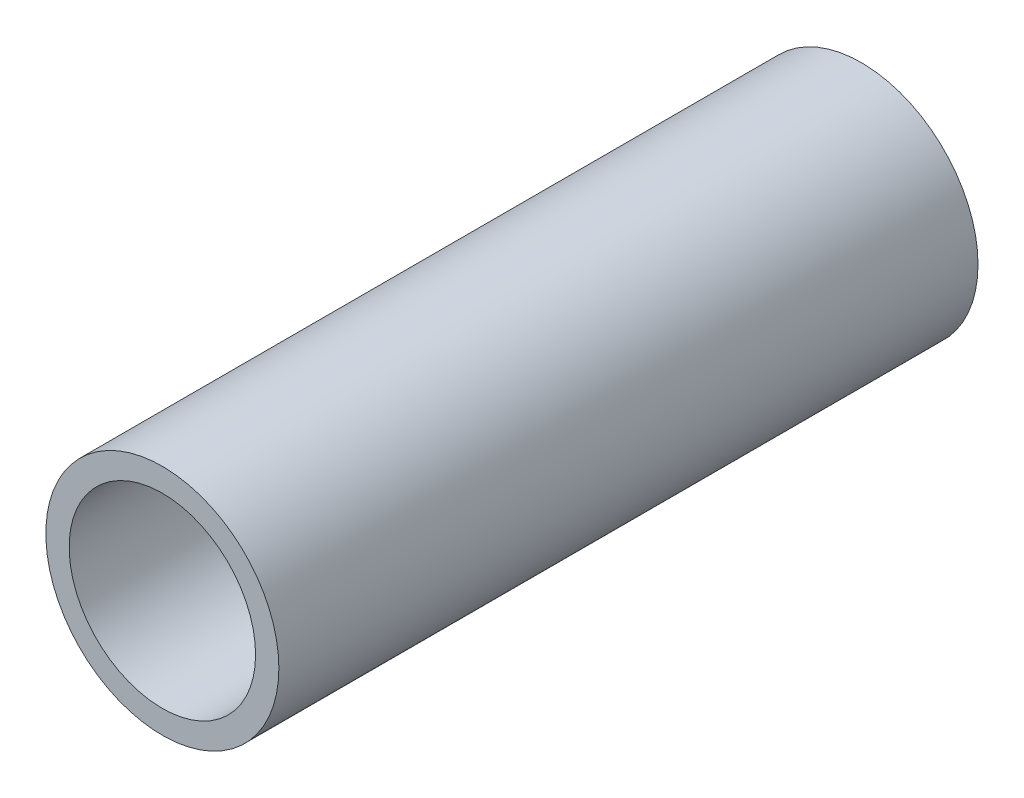
ISO-10303-21;
HEADER;
FILE_DESCRIPTION(('STEP AP214'),'2;1');
FILE_NAME('part.step','',(''),(''),'','','');
FILE_SCHEMA(('AUTOMOTIVE_DESIGN { 1 0 10303 214 1 1 1 1 }'));
ENDSEC;
DATA;
#1=APPLICATION_CONTEXT('core data for automotive mechanical design processes');
#2=APPLICATION_PROTOCOL_DEFINITION('international standard','automotive_design',2000,#1);
#3=PRODUCT_CONTEXT('',#1,'mechanical');
#4=PRODUCT('Part','Part','',(#3));
#5=PRODUCT_RELATED_PRODUCT_CATEGORY('part','',(#4));
#6=PRODUCT_DEFINITION_FORMATION('','',#4);
#7=PRODUCT_DEFINITION_CONTEXT('part definition',#1,'design');
#8=PRODUCT_DEFINITION('design','',#6,#7);
#9=PRODUCT_DEFINITION_SHAPE('','',#8);
#10=(LENGTH_UNIT() NAMED_UNIT(*) SI_UNIT(.MILLI.,.METRE.));
#11=(NAMED_UNIT(*) PLANE_ANGLE_UNIT() SI_UNIT($,.RADIAN.));
#12=(NAMED_UNIT(*) SI_UNIT($,.STERADIAN.) SOLID_ANGLE_UNIT());
#13=UNCERTAINTY_MEASURE_WITH_UNIT(LENGTH_MEASURE(1.E-05),#10,'distance_accuracy_value','');
#14=(GEOMETRIC_REPRESENTATION_CONTEXT(3) GLOBAL_UNCERTAINTY_ASSIGNED_CONTEXT((#13)) GLOBAL_UNIT_ASSIGNED_CONTEXT((#10,
#11,#12)) REPRESENTATION_CONTEXT('',''));
#15=CARTESIAN_POINT('',(0.,0.,0.));
#16=DIRECTION('',(0.,0.,1.));
#17=DIRECTION('',(1.,0.,0.));
#18=AXIS2_PLACEMENT_3D('',#15,#16,#17);
#19=CARTESIAN_POINT('',(0.,0.,30.));
#20=DIRECTION('',(0.,0.,1.));
#21=DIRECTION('',(1.,0.,0.));
#22=AXIS2_PLACEMENT_3D('',#19,#20,#21);
#23=PLANE('',#22);
#24=CARTESIAN_POINT('',(0.,0.,30.));
#25=DIRECTION('',(0.,0.,1.));
#26=DIRECTION('',(1.,0.,0.));
#27=AXIS2_PLACEMENT_3D('',#24,#25,#26);
#28=CIRCLE('',#27,5.);
#29=CARTESIAN_POINT('',(5.,0.,30.));
#30=VERTEX_POINT('',#29);
#31=EDGE_CURVE('E10',#30,#30,#28,.T.);
#32=ORIENTED_EDGE('',*,*,#31,.T.);
#33=EDGE_LOOP('',(#32));
#34=FACE_BOUND('',#33,.T.);
#35=CARTESIAN_POINT('',(0.,0.,30.));
#36=DIRECTION('',(0.,0.,1.));
#37=DIRECTION('',(1.,0.,0.));
#38=AXIS2_PLACEMENT_3D('',#35,#36,#37);
#39=CIRCLE('',#38,4.);
#40=CARTESIAN_POINT('',(4.,0.,30.));
#41=VERTEX_POINT('',#40);
#42=EDGE_CURVE('E48',#41,#41,#39,.T.);
#43=ORIENTED_EDGE('',*,*,#42,.F.);
#44=EDGE_LOOP('',(#43));
#45=FACE_BOUND('',#44,.T.);
#46=ADVANCED_FACE('F37',(#34,#45),#23,.T.);
#47=CARTESIAN_POINT('',(0.,0.,0.));
#48=DIRECTION('',(0.,0.,1.));
#49=DIRECTION('',(1.,0.,0.));
#50=AXIS2_PLACEMENT_3D('',#47,#48,#49);
#51=PLANE('',#50);
#52=CARTESIAN_POINT('',(0.,0.,0.));
#53=DIRECTION('',(0.,0.,1.));
#54=DIRECTION('',(1.,0.,0.));
#55=AXIS2_PLACEMENT_3D('',#52,#53,#54);
#56=CIRCLE('',#55,5.);
#57=CARTESIAN_POINT('',(5.,0.,0.));
#58=VERTEX_POINT('',#57);
#59=EDGE_CURVE('E41',#58,#58,#56,.T.);
#60=ORIENTED_EDGE('',*,*,#59,.F.);
#61=EDGE_LOOP('',(#60));
#62=FACE_BOUND('',#61,.T.);
#63=CARTESIAN_POINT('',(0.,0.,0.));
#64=DIRECTION('',(0.,0.,1.));
#65=DIRECTION('',(1.,0.,0.));
#66=AXIS2_PLACEMENT_3D('',#63,#64,#65);
#67=CIRCLE('',#66,4.);
#68=CARTESIAN_POINT('',(4.,0.,0.));
#69=VERTEX_POINT('',#68);
#70=EDGE_CURVE('E50',#69,#69,#67,.T.);
#71=ORIENTED_EDGE('',*,*,#70,.T.);
#72=EDGE_LOOP('',(#71));
#73=FACE_BOUND('',#72,.T.);
#74=ADVANCED_FACE('F60',(#62,#73),#51,.F.);
#75=CARTESIAN_POINT('',(0.,0.,30.));
#76=DIRECTION('',(0.,0.,-1.));
#77=DIRECTION('',(-1.,0.,0.));
#78=AXIS2_PLACEMENT_3D('',#75,#76,#77);
#79=CYLINDRICAL_SURFACE('',#78,5.);
#80=ORIENTED_EDGE('',*,*,#31,.F.);
#81=EDGE_LOOP('',(#80));
#82=FACE_BOUND('',#81,.T.);
#83=ORIENTED_EDGE('',*,*,#59,.T.);
#84=EDGE_LOOP('',(#83));
#85=FACE_BOUND('',#84,.T.);
#86=ADVANCED_FACE('F39',(#82,#85),#79,.T.);
#87=CARTESIAN_POINT('',(0.,0.,30.));
#88=DIRECTION('',(0.,0.,-1.));
#89=DIRECTION('',(-1.,0.,0.));
#90=AXIS2_PLACEMENT_3D('',#87,#88,#89);
#91=CYLINDRICAL_SURFACE('',#90,4.);
#92=ORIENTED_EDGE('',*,*,#42,.T.);
#93=EDGE_LOOP('',(#92));
#94=FACE_BOUND('',#93,.T.);
#95=ORIENTED_EDGE('',*,*,#70,.F.);
#96=EDGE_LOOP('',(#95));
#97=FACE_BOUND('',#96,.T.);
#98=ADVANCED_FACE('F56',(#94,#97),#91,.F.);
#99=CLOSED_SHELL('',(#46,#74,#86,#98));
#100=MANIFOLD_SOLID_BREP('B2',#99);
#101=ADVANCED_BREP_SHAPE_REPRESENTATION('',(#18,#100),#14);
#102=SHAPE_DEFINITION_REPRESENTATION(#9,#101);
ENDSEC;
END-ISO-10303-21;
